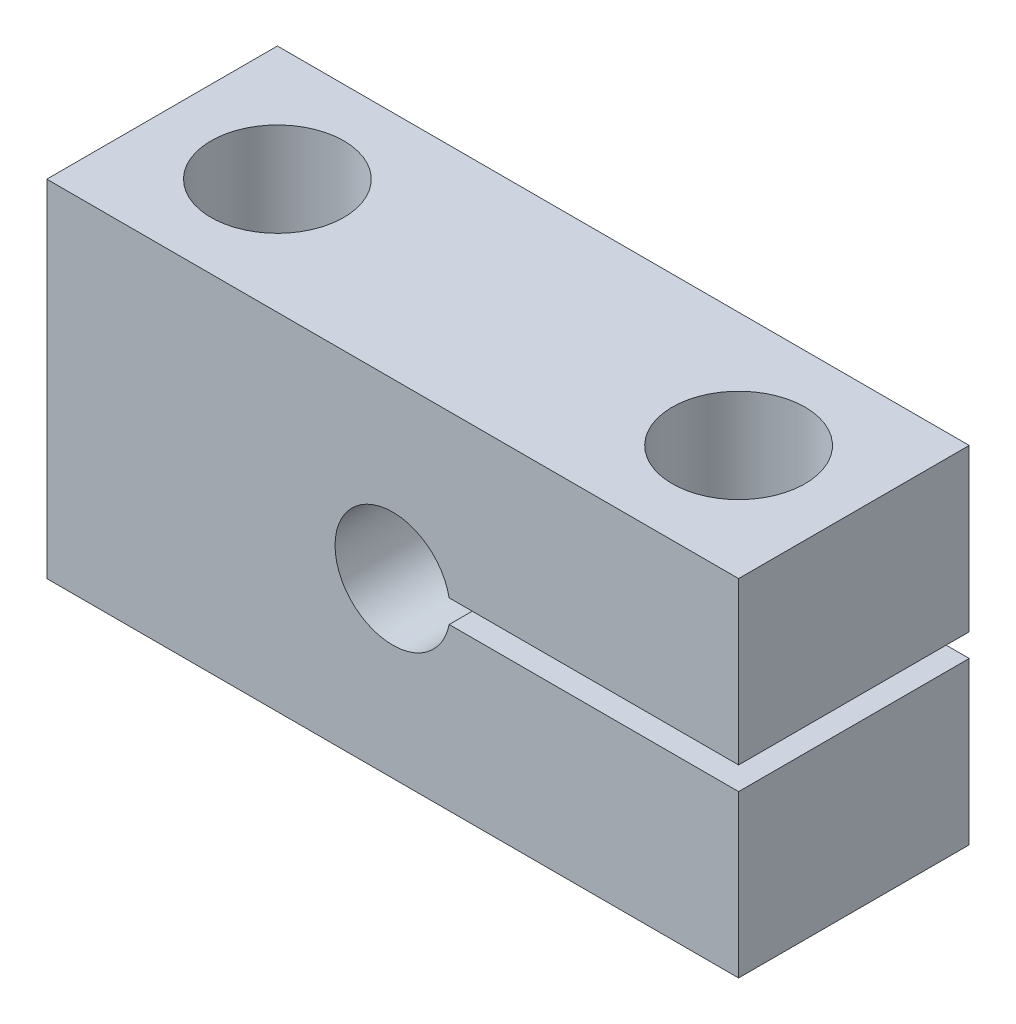
ISO-10303-21;
HEADER;
FILE_DESCRIPTION(('STEP AP214'),'2;1');
FILE_NAME('part.step','',(''),(''),'','','');
FILE_SCHEMA(('AUTOMOTIVE_DESIGN { 1 0 10303 214 1 1 1 1 }'));
ENDSEC;
DATA;
#1=APPLICATION_CONTEXT('core data for automotive mechanical design processes');
#2=APPLICATION_PROTOCOL_DEFINITION('international standard','automotive_design',2000,#1);
#3=PRODUCT_CONTEXT('',#1,'mechanical');
#4=PRODUCT('Part','Part','',(#3));
#5=PRODUCT_RELATED_PRODUCT_CATEGORY('part','',(#4));
#6=PRODUCT_DEFINITION_FORMATION('','',#4);
#7=PRODUCT_DEFINITION_CONTEXT('part definition',#1,'design');
#8=PRODUCT_DEFINITION('design','',#6,#7);
#9=PRODUCT_DEFINITION_SHAPE('','',#8);
#10=(LENGTH_UNIT() NAMED_UNIT(*) SI_UNIT(.MILLI.,.METRE.));
#11=(NAMED_UNIT(*) PLANE_ANGLE_UNIT() SI_UNIT($,.RADIAN.));
#12=(NAMED_UNIT(*) SI_UNIT($,.STERADIAN.) SOLID_ANGLE_UNIT());
#13=UNCERTAINTY_MEASURE_WITH_UNIT(LENGTH_MEASURE(1.E-05),#10,'distance_accuracy_value','');
#14=(GEOMETRIC_REPRESENTATION_CONTEXT(3) GLOBAL_UNCERTAINTY_ASSIGNED_CONTEXT((#13)) GLOBAL_UNIT_ASSIGNED_CONTEXT((#10,
#11,#12)) REPRESENTATION_CONTEXT('',''));
#15=CARTESIAN_POINT('',(0.,0.,0.));
#16=DIRECTION('',(0.,0.,1.));
#17=DIRECTION('',(1.,0.,0.));
#18=AXIS2_PLACEMENT_3D('',#15,#16,#17);
#19=CARTESIAN_POINT('',(-9.525,-4.7625,6.35));
#20=DIRECTION('',(1.,0.,0.));
#21=DIRECTION('',(0.,0.,-1.));
#22=AXIS2_PLACEMENT_3D('',#19,#20,#21);
#23=PLANE('',#22);
#24=DIRECTION('',(0.,-1.,0.));
#25=VECTOR('',#24,1.);
#26=CARTESIAN_POINT('',(-9.525,-4.7625,0.));
#27=LINE('',#26,#25);
#28=CARTESIAN_POINT('',(-9.525,4.7625,0.));
#29=VERTEX_POINT('',#28);
#30=CARTESIAN_POINT('',(-9.525,-4.7625,0.));
#31=VERTEX_POINT('',#30);
#32=EDGE_CURVE('E129',#29,#31,#27,.T.);
#33=ORIENTED_EDGE('',*,*,#32,.T.);
#34=DIRECTION('',(0.,0.,-1.));
#35=VECTOR('',#34,1.);
#36=CARTESIAN_POINT('',(-9.525,-4.7625,6.35));
#37=LINE('',#36,#35);
#38=CARTESIAN_POINT('',(-9.525,-4.7625,6.35));
#39=VERTEX_POINT('',#38);
#40=EDGE_CURVE('E11',#39,#31,#37,.T.);
#41=ORIENTED_EDGE('',*,*,#40,.F.);
#42=DIRECTION('',(0.,-1.,0.));
#43=VECTOR('',#42,1.);
#44=CARTESIAN_POINT('',(-9.525,-4.7625,6.35));
#45=LINE('',#44,#43);
#46=CARTESIAN_POINT('',(-9.525,4.7625,6.35));
#47=VERTEX_POINT('',#46);
#48=EDGE_CURVE('E144',#47,#39,#45,.T.);
#49=ORIENTED_EDGE('',*,*,#48,.F.);
#50=DIRECTION('',(0.,0.,-1.));
#51=VECTOR('',#50,1.);
#52=CARTESIAN_POINT('',(-9.525,4.7625,6.35));
#53=LINE('',#52,#51);
#54=EDGE_CURVE('E125',#47,#29,#53,.T.);
#55=ORIENTED_EDGE('',*,*,#54,.T.);
#56=EDGE_LOOP('',(#33,#41,#49,#55));
#57=FACE_BOUND('',#56,.T.);
#58=ADVANCED_FACE('F33',(#57),#23,.F.);
#59=CARTESIAN_POINT('',(-9.525,-4.7625,6.35));
#60=DIRECTION('',(0.,1.,0.));
#61=DIRECTION('',(0.,0.,1.));
#62=AXIS2_PLACEMENT_3D('',#59,#60,#61);
#63=PLANE('',#62);
#64=CARTESIAN_POINT('',(6.35,-4.7625,3.175));
#65=DIRECTION('',(0.,-1.,0.));
#66=DIRECTION('',(0.,0.,-1.));
#67=AXIS2_PLACEMENT_3D('',#64,#65,#66);
#68=CIRCLE('',#67,1.8288);
#69=CARTESIAN_POINT('',(6.35,-4.7625,1.3462));
#70=VERTEX_POINT('',#69);
#71=EDGE_CURVE('E189',#70,#70,#68,.T.);
#72=ORIENTED_EDGE('',*,*,#71,.F.);
#73=EDGE_LOOP('',(#72));
#74=FACE_BOUND('',#73,.T.);
#75=CARTESIAN_POINT('',(-6.35,-4.7625,3.175));
#76=DIRECTION('',(0.,-1.,0.));
#77=DIRECTION('',(0.,0.,-1.));
#78=AXIS2_PLACEMENT_3D('',#75,#76,#77);
#79=CIRCLE('',#78,1.8288);
#80=CARTESIAN_POINT('',(-6.35,-4.7625,1.3462));
#81=VERTEX_POINT('',#80);
#82=EDGE_CURVE('E177',#81,#81,#79,.T.);
#83=ORIENTED_EDGE('',*,*,#82,.F.);
#84=EDGE_LOOP('',(#83));
#85=FACE_BOUND('',#84,.T.);
#86=DIRECTION('',(1.,0.,0.));
#87=VECTOR('',#86,1.);
#88=CARTESIAN_POINT('',(-9.525,-4.7625,0.));
#89=LINE('',#88,#87);
#90=CARTESIAN_POINT('',(9.525,-4.7625,0.));
#91=VERTEX_POINT('',#90);
#92=EDGE_CURVE('E132',#31,#91,#89,.T.);
#93=ORIENTED_EDGE('',*,*,#92,.T.);
#94=DIRECTION('',(0.,0.,-1.));
#95=VECTOR('',#94,1.);
#96=CARTESIAN_POINT('',(9.525,-4.7625,6.35));
#97=LINE('',#96,#95);
#98=CARTESIAN_POINT('',(9.525,-4.7625,6.35));
#99=VERTEX_POINT('',#98);
#100=EDGE_CURVE('E41',#99,#91,#97,.T.);
#101=ORIENTED_EDGE('',*,*,#100,.F.);
#102=DIRECTION('',(1.,0.,0.));
#103=VECTOR('',#102,1.);
#104=CARTESIAN_POINT('',(-9.525,-4.7625,6.35));
#105=LINE('',#104,#103);
#106=EDGE_CURVE('E92',#39,#99,#105,.T.);
#107=ORIENTED_EDGE('',*,*,#106,.F.);
#108=ORIENTED_EDGE('',*,*,#40,.T.);
#109=EDGE_LOOP('',(#93,#101,#107,#108));
#110=FACE_BOUND('',#109,.T.);
#111=ADVANCED_FACE('F215',(#74,#85,#110),#63,.F.);
#112=CARTESIAN_POINT('',(9.525,-4.7625,6.35));
#113=DIRECTION('',(-1.,0.,0.));
#114=DIRECTION('',(0.,0.,1.));
#115=AXIS2_PLACEMENT_3D('',#112,#113,#114);
#116=PLANE('',#115);
#117=DIRECTION('',(0.,1.,0.));
#118=VECTOR('',#117,1.);
#119=CARTESIAN_POINT('',(9.525,-4.7625,0.));
#120=LINE('',#119,#118);
#121=CARTESIAN_POINT('',(9.525,-0.3175,0.));
#122=VERTEX_POINT('',#121);
#123=EDGE_CURVE('E135',#91,#122,#120,.T.);
#124=ORIENTED_EDGE('',*,*,#123,.T.);
#125=DIRECTION('',(0.,0.,-1.));
#126=VECTOR('',#125,1.);
#127=CARTESIAN_POINT('',(9.525,-0.3175,6.35));
#128=LINE('',#127,#126);
#129=CARTESIAN_POINT('',(9.525,-0.3175,6.35));
#130=VERTEX_POINT('',#129);
#131=EDGE_CURVE('E151',#130,#122,#128,.T.);
#132=ORIENTED_EDGE('',*,*,#131,.F.);
#133=DIRECTION('',(0.,1.,0.));
#134=VECTOR('',#133,1.);
#135=CARTESIAN_POINT('',(9.525,-4.7625,6.35));
#136=LINE('',#135,#134);
#137=EDGE_CURVE('E159',#99,#130,#136,.T.);
#138=ORIENTED_EDGE('',*,*,#137,.F.);
#139=ORIENTED_EDGE('',*,*,#100,.T.);
#140=EDGE_LOOP('',(#124,#132,#138,#139));
#141=FACE_BOUND('',#140,.T.);
#142=ADVANCED_FACE('F157',(#141),#116,.F.);
#143=CARTESIAN_POINT('',(1.55542598666732,-0.3175,6.35));
#144=DIRECTION('',(0.,-1.,0.));
#145=DIRECTION('',(0.,0.,-1.));
#146=AXIS2_PLACEMENT_3D('',#143,#144,#145);
#147=PLANE('',#146);
#148=CARTESIAN_POINT('',(6.35,-0.3175,3.175));
#149=DIRECTION('',(0.,-1.,0.));
#150=DIRECTION('',(0.,0.,-1.));
#151=AXIS2_PLACEMENT_3D('',#148,#149,#150);
#152=CIRCLE('',#151,1.8288);
#153=CARTESIAN_POINT('',(6.35,-0.3175,1.3462));
#154=VERTEX_POINT('',#153);
#155=EDGE_CURVE('E180',#154,#154,#152,.T.);
#156=ORIENTED_EDGE('',*,*,#155,.T.);
#157=EDGE_LOOP('',(#156));
#158=FACE_BOUND('',#157,.T.);
#159=DIRECTION('',(-1.,0.,0.));
#160=VECTOR('',#159,1.);
#161=CARTESIAN_POINT('',(1.55542598666732,-0.3175,0.));
#162=LINE('',#161,#160);
#163=CARTESIAN_POINT('',(1.55542598666732,-0.3175,0.));
#164=VERTEX_POINT('',#163);
#165=EDGE_CURVE('E137',#122,#164,#162,.T.);
#166=ORIENTED_EDGE('',*,*,#165,.T.);
#167=DIRECTION('',(0.,0.,-1.));
#168=VECTOR('',#167,1.);
#169=CARTESIAN_POINT('',(1.55542598666732,-0.3175,6.35));
#170=LINE('',#169,#168);
#171=CARTESIAN_POINT('',(1.55542598666732,-0.3175,6.35));
#172=VERTEX_POINT('',#171);
#173=EDGE_CURVE('E148',#172,#164,#170,.T.);
#174=ORIENTED_EDGE('',*,*,#173,.F.);
#175=DIRECTION('',(-1.,0.,0.));
#176=VECTOR('',#175,1.);
#177=CARTESIAN_POINT('',(1.55542598666732,-0.3175,6.35));
#178=LINE('',#177,#176);
#179=EDGE_CURVE('E171',#130,#172,#178,.T.);
#180=ORIENTED_EDGE('',*,*,#179,.F.);
#181=ORIENTED_EDGE('',*,*,#131,.T.);
#182=EDGE_LOOP('',(#166,#174,#180,#181));
#183=FACE_BOUND('',#182,.T.);
#184=ADVANCED_FACE('F167',(#158,#183),#147,.F.);
#185=CARTESIAN_POINT('',(0.,0.,6.35));
#186=DIRECTION('',(0.,0.,-1.));
#187=DIRECTION('',(-1.,0.,0.));
#188=AXIS2_PLACEMENT_3D('',#185,#186,#187);
#189=CYLINDRICAL_SURFACE('',#188,1.5875);
#190=CARTESIAN_POINT('',(0.,0.,0.));
#191=DIRECTION('',(0.,0.,-1.));
#192=DIRECTION('',(1.,0.,0.));
#193=AXIS2_PLACEMENT_3D('',#190,#191,#192);
#194=CIRCLE('',#193,1.5875);
#195=CARTESIAN_POINT('',(1.55542598666732,0.3175,0.));
#196=VERTEX_POINT('',#195);
#197=EDGE_CURVE('E139',#164,#196,#194,.T.);
#198=ORIENTED_EDGE('',*,*,#197,.T.);
#199=DIRECTION('',(0.,0.,-1.));
#200=VECTOR('',#199,1.);
#201=CARTESIAN_POINT('',(1.55542598666732,0.3175,6.35));
#202=LINE('',#201,#200);
#203=CARTESIAN_POINT('',(1.55542598666732,0.3175,6.35));
#204=VERTEX_POINT('',#203);
#205=EDGE_CURVE('E120',#204,#196,#202,.T.);
#206=ORIENTED_EDGE('',*,*,#205,.F.);
#207=CARTESIAN_POINT('',(0.,0.,6.35));
#208=DIRECTION('',(0.,0.,-1.));
#209=DIRECTION('',(1.,0.,0.));
#210=AXIS2_PLACEMENT_3D('',#207,#208,#209);
#211=CIRCLE('',#210,1.5875);
#212=EDGE_CURVE('E111',#172,#204,#211,.T.);
#213=ORIENTED_EDGE('',*,*,#212,.F.);
#214=ORIENTED_EDGE('',*,*,#173,.T.);
#215=EDGE_LOOP('',(#198,#206,#213,#214));
#216=FACE_BOUND('',#215,.T.);
#217=ADVANCED_FACE('F170',(#216),#189,.F.);
#218=CARTESIAN_POINT('',(1.55542598666732,0.3175,6.35));
#219=DIRECTION('',(0.,1.,0.));
#220=DIRECTION('',(0.,0.,1.));
#221=AXIS2_PLACEMENT_3D('',#218,#219,#220);
#222=PLANE('',#221);
#223=CARTESIAN_POINT('',(6.35,0.3175,3.175));
#224=DIRECTION('',(0.,1.,0.));
#225=DIRECTION('',(0.,0.,1.));
#226=AXIS2_PLACEMENT_3D('',#223,#224,#225);
#227=CIRCLE('',#226,1.8288);
#228=CARTESIAN_POINT('',(6.35,0.3175,1.3462));
#229=VERTEX_POINT('',#228);
#230=EDGE_CURVE('E185',#229,#229,#227,.T.);
#231=ORIENTED_EDGE('',*,*,#230,.T.);
#232=EDGE_LOOP('',(#231));
#233=FACE_BOUND('',#232,.T.);
#234=DIRECTION('',(1.,0.,0.));
#235=VECTOR('',#234,1.);
#236=CARTESIAN_POINT('',(1.55542598666732,0.3175,0.));
#237=LINE('',#236,#235);
#238=CARTESIAN_POINT('',(9.525,0.3175,0.));
#239=VERTEX_POINT('',#238);
#240=EDGE_CURVE('E119',#196,#239,#237,.T.);
#241=ORIENTED_EDGE('',*,*,#240,.T.);
#242=DIRECTION('',(0.,0.,-1.));
#243=VECTOR('',#242,1.);
#244=CARTESIAN_POINT('',(9.525,0.3175,6.35));
#245=LINE('',#244,#243);
#246=CARTESIAN_POINT('',(9.525,0.3175,6.35));
#247=VERTEX_POINT('',#246);
#248=EDGE_CURVE('E116',#247,#239,#245,.T.);
#249=ORIENTED_EDGE('',*,*,#248,.F.);
#250=DIRECTION('',(1.,0.,0.));
#251=VECTOR('',#250,1.);
#252=CARTESIAN_POINT('',(1.55542598666732,0.3175,6.35));
#253=LINE('',#252,#251);
#254=EDGE_CURVE('E105',#204,#247,#253,.T.);
#255=ORIENTED_EDGE('',*,*,#254,.F.);
#256=ORIENTED_EDGE('',*,*,#205,.T.);
#257=EDGE_LOOP('',(#241,#249,#255,#256));
#258=FACE_BOUND('',#257,.T.);
#259=ADVANCED_FACE('F117',(#233,#258),#222,.F.);
#260=CARTESIAN_POINT('',(9.525,0.3175,6.35));
#261=DIRECTION('',(-1.,0.,0.));
#262=DIRECTION('',(0.,0.,1.));
#263=AXIS2_PLACEMENT_3D('',#260,#261,#262);
#264=PLANE('',#263);
#265=DIRECTION('',(0.,1.,0.));
#266=VECTOR('',#265,1.);
#267=CARTESIAN_POINT('',(9.525,0.3175,0.));
#268=LINE('',#267,#266);
#269=CARTESIAN_POINT('',(9.525,4.7625,0.));
#270=VERTEX_POINT('',#269);
#271=EDGE_CURVE('E78',#239,#270,#268,.T.);
#272=ORIENTED_EDGE('',*,*,#271,.T.);
#273=DIRECTION('',(0.,0.,-1.));
#274=VECTOR('',#273,1.);
#275=CARTESIAN_POINT('',(9.525,4.7625,6.35));
#276=LINE('',#275,#274);
#277=CARTESIAN_POINT('',(9.525,4.7625,6.35));
#278=VERTEX_POINT('',#277);
#279=EDGE_CURVE('E121',#278,#270,#276,.T.);
#280=ORIENTED_EDGE('',*,*,#279,.F.);
#281=DIRECTION('',(0.,1.,0.));
#282=VECTOR('',#281,1.);
#283=CARTESIAN_POINT('',(9.525,0.3175,6.35));
#284=LINE('',#283,#282);
#285=EDGE_CURVE('E109',#247,#278,#284,.T.);
#286=ORIENTED_EDGE('',*,*,#285,.F.);
#287=ORIENTED_EDGE('',*,*,#248,.T.);
#288=EDGE_LOOP('',(#272,#280,#286,#287));
#289=FACE_BOUND('',#288,.T.);
#290=ADVANCED_FACE('F123',(#289),#264,.F.);
#291=CARTESIAN_POINT('',(-9.525,4.7625,6.35));
#292=DIRECTION('',(0.,-1.,0.));
#293=DIRECTION('',(0.,0.,-1.));
#294=AXIS2_PLACEMENT_3D('',#291,#292,#293);
#295=PLANE('',#294);
#296=CARTESIAN_POINT('',(6.35,4.7625,3.175));
#297=DIRECTION('',(0.,-1.,0.));
#298=DIRECTION('',(0.,0.,-1.));
#299=AXIS2_PLACEMENT_3D('',#296,#297,#298);
#300=CIRCLE('',#299,1.8288);
#301=CARTESIAN_POINT('',(6.35,4.7625,1.3462));
#302=VERTEX_POINT('',#301);
#303=EDGE_CURVE('E188',#302,#302,#300,.T.);
#304=ORIENTED_EDGE('',*,*,#303,.T.);
#305=EDGE_LOOP('',(#304));
#306=FACE_BOUND('',#305,.T.);
#307=CARTESIAN_POINT('',(-6.35,4.7625,3.175));
#308=DIRECTION('',(0.,-1.,0.));
#309=DIRECTION('',(0.,0.,-1.));
#310=AXIS2_PLACEMENT_3D('',#307,#308,#309);
#311=CIRCLE('',#310,1.8288);
#312=CARTESIAN_POINT('',(-6.35,4.7625,1.3462));
#313=VERTEX_POINT('',#312);
#314=EDGE_CURVE('E133',#313,#313,#311,.T.);
#315=ORIENTED_EDGE('',*,*,#314,.T.);
#316=EDGE_LOOP('',(#315));
#317=FACE_BOUND('',#316,.T.);
#318=DIRECTION('',(-1.,0.,0.));
#319=VECTOR('',#318,1.);
#320=CARTESIAN_POINT('',(-9.525,4.7625,0.));
#321=LINE('',#320,#319);
#322=EDGE_CURVE('E84',#270,#29,#321,.T.);
#323=ORIENTED_EDGE('',*,*,#322,.T.);
#324=ORIENTED_EDGE('',*,*,#54,.F.);
#325=DIRECTION('',(-1.,0.,0.));
#326=VECTOR('',#325,1.);
#327=CARTESIAN_POINT('',(-9.525,4.7625,6.35));
#328=LINE('',#327,#326);
#329=EDGE_CURVE('E49',#278,#47,#328,.T.);
#330=ORIENTED_EDGE('',*,*,#329,.F.);
#331=ORIENTED_EDGE('',*,*,#279,.T.);
#332=EDGE_LOOP('',(#323,#324,#330,#331));
#333=FACE_BOUND('',#332,.T.);
#334=ADVANCED_FACE('F195',(#306,#317,#333),#295,.F.);
#335=CARTESIAN_POINT('',(0.,0.,6.35));
#336=DIRECTION('',(0.,0.,1.));
#337=DIRECTION('',(1.,0.,0.));
#338=AXIS2_PLACEMENT_3D('',#335,#336,#337);
#339=PLANE('',#338);
#340=ORIENTED_EDGE('',*,*,#48,.T.);
#341=ORIENTED_EDGE('',*,*,#106,.T.);
#342=ORIENTED_EDGE('',*,*,#137,.T.);
#343=ORIENTED_EDGE('',*,*,#179,.T.);
#344=ORIENTED_EDGE('',*,*,#212,.T.);
#345=ORIENTED_EDGE('',*,*,#254,.T.);
#346=ORIENTED_EDGE('',*,*,#285,.T.);
#347=ORIENTED_EDGE('',*,*,#329,.T.);
#348=EDGE_LOOP('',(#340,#341,#342,#343,#344,#345,#346,#347));
#349=FACE_BOUND('',#348,.T.);
#350=ADVANCED_FACE('F107',(#349),#339,.T.);
#351=CARTESIAN_POINT('',(0.,0.,0.));
#352=DIRECTION('',(0.,0.,1.));
#353=DIRECTION('',(1.,0.,0.));
#354=AXIS2_PLACEMENT_3D('',#351,#352,#353);
#355=PLANE('',#354);
#356=ORIENTED_EDGE('',*,*,#32,.F.);
#357=ORIENTED_EDGE('',*,*,#322,.F.);
#358=ORIENTED_EDGE('',*,*,#271,.F.);
#359=ORIENTED_EDGE('',*,*,#240,.F.);
#360=ORIENTED_EDGE('',*,*,#197,.F.);
#361=ORIENTED_EDGE('',*,*,#165,.F.);
#362=ORIENTED_EDGE('',*,*,#123,.F.);
#363=ORIENTED_EDGE('',*,*,#92,.F.);
#364=EDGE_LOOP('',(#356,#357,#358,#359,#360,#361,#362,#363));
#365=FACE_BOUND('',#364,.T.);
#366=ADVANCED_FACE('F163',(#365),#355,.F.);
#367=CARTESIAN_POINT('',(-6.35,4.7625,3.175));
#368=DIRECTION('',(0.,-1.,0.));
#369=DIRECTION('',(0.,0.,-1.));
#370=AXIS2_PLACEMENT_3D('',#367,#368,#369);
#371=CYLINDRICAL_SURFACE('',#370,1.8288);
#372=CARTESIAN_POINT('',(-6.35,4.7625,1.3462));
#373=CARTESIAN_POINT('',(-6.35,4.66328125,1.3462));
#374=CARTESIAN_POINT('',(-6.35,4.5640625,1.3462));
#375=CARTESIAN_POINT('',(-6.35,4.365625,1.3462));
#376=CARTESIAN_POINT('',(-6.35,4.26640625,1.3462));
#377=CARTESIAN_POINT('',(-6.35,4.06796875,1.3462));
#378=CARTESIAN_POINT('',(-6.35,3.96875,1.3462));
#379=CARTESIAN_POINT('',(-6.35,3.7703125,1.3462));
#380=CARTESIAN_POINT('',(-6.35,3.67109375,1.3462));
#381=CARTESIAN_POINT('',(-6.35,3.47265625,1.3462));
#382=CARTESIAN_POINT('',(-6.35,3.3734375,1.3462));
#383=CARTESIAN_POINT('',(-6.35,3.175,1.3462));
#384=CARTESIAN_POINT('',(-6.35,3.07578125,1.3462));
#385=CARTESIAN_POINT('',(-6.35,2.87734375,1.3462));
#386=CARTESIAN_POINT('',(-6.35,2.778125,1.3462));
#387=CARTESIAN_POINT('',(-6.35,2.5796875,1.3462));
#388=CARTESIAN_POINT('',(-6.35,2.48046875,1.3462));
#389=CARTESIAN_POINT('',(-6.35,2.28203125,1.3462));
#390=CARTESIAN_POINT('',(-6.35,2.1828125,1.3462));
#391=CARTESIAN_POINT('',(-6.35,1.984375,1.3462));
#392=CARTESIAN_POINT('',(-6.35,1.88515625,1.3462));
#393=CARTESIAN_POINT('',(-6.35,1.68671875,1.3462));
#394=CARTESIAN_POINT('',(-6.35,1.5875,1.3462));
#395=CARTESIAN_POINT('',(-6.35,1.3890625,1.3462));
#396=CARTESIAN_POINT('',(-6.35,1.28984375,1.3462));
#397=CARTESIAN_POINT('',(-6.35,1.09140625,1.3462));
#398=CARTESIAN_POINT('',(-6.35,0.9921875,1.3462));
#399=CARTESIAN_POINT('',(-6.35,0.793750000000001,1.3462));
#400=CARTESIAN_POINT('',(-6.35,0.694531250000001,1.3462));
#401=CARTESIAN_POINT('',(-6.35,0.496093750000001,1.3462));
#402=CARTESIAN_POINT('',(-6.35,0.396875000000001,1.3462));
#403=CARTESIAN_POINT('',(-6.35,0.198437500000001,1.3462));
#404=CARTESIAN_POINT('',(-6.35,0.0992187500000009,1.3462));
#405=CARTESIAN_POINT('',(-6.35,-0.0992187499999992,1.3462));
#406=CARTESIAN_POINT('',(-6.35,-0.198437499999999,1.3462));
#407=CARTESIAN_POINT('',(-6.35,-0.396874999999999,1.3462));
#408=CARTESIAN_POINT('',(-6.35,-0.496093749999999,1.3462));
#409=CARTESIAN_POINT('',(-6.35,-0.694531249999999,1.3462));
#410=CARTESIAN_POINT('',(-6.35,-0.79375,1.3462));
#411=CARTESIAN_POINT('',(-6.35,-0.9921875,1.3462));
#412=CARTESIAN_POINT('',(-6.35,-1.09140625,1.3462));
#413=CARTESIAN_POINT('',(-6.35,-1.28984375,1.3462));
#414=CARTESIAN_POINT('',(-6.35,-1.3890625,1.3462));
#415=CARTESIAN_POINT('',(-6.35,-1.5875,1.3462));
#416=CARTESIAN_POINT('',(-6.35,-1.68671875,1.3462));
#417=CARTESIAN_POINT('',(-6.35,-1.88515625,1.3462));
#418=CARTESIAN_POINT('',(-6.35,-1.984375,1.3462));
#419=CARTESIAN_POINT('',(-6.35,-2.1828125,1.3462));
#420=CARTESIAN_POINT('',(-6.35,-2.28203125,1.3462));
#421=CARTESIAN_POINT('',(-6.35,-2.48046875,1.3462));
#422=CARTESIAN_POINT('',(-6.35,-2.5796875,1.3462));
#423=CARTESIAN_POINT('',(-6.35,-2.778125,1.3462));
#424=CARTESIAN_POINT('',(-6.35,-2.87734375,1.3462));
#425=CARTESIAN_POINT('',(-6.35,-3.07578125,1.3462));
#426=CARTESIAN_POINT('',(-6.35,-3.175,1.3462));
#427=CARTESIAN_POINT('',(-6.35,-3.3734375,1.3462));
#428=CARTESIAN_POINT('',(-6.35,-3.47265625,1.3462));
#429=CARTESIAN_POINT('',(-6.35,-3.67109375,1.3462));
#430=CARTESIAN_POINT('',(-6.35,-3.7703125,1.3462));
#431=CARTESIAN_POINT('',(-6.35,-3.96875,1.3462));
#432=CARTESIAN_POINT('',(-6.35,-4.06796875,1.3462));
#433=CARTESIAN_POINT('',(-6.35,-4.26640625,1.3462));
#434=CARTESIAN_POINT('',(-6.35,-4.365625,1.3462));
#435=CARTESIAN_POINT('',(-6.35,-4.5640625,1.3462));
#436=CARTESIAN_POINT('',(-6.35,-4.66328125,1.3462));
#437=CARTESIAN_POINT('',(-6.35,-4.7625,1.3462));
#438=B_SPLINE_CURVE_WITH_KNOTS('',3,(#372,#373,#374,#375,#376,#377,#378,#379,#380,#381,#382,
#383,#384,#385,#386,#387,#388,#389,#390,#391,#392,#393,#394,#395,#396,#397,#398,#399,#400,#401,
#402,#403,#404,#405,#406,#407,#408,#409,#410,#411,#412,#413,#414,#415,#416,#417,#418,#419,#420,
#421,#422,#423,#424,#425,#426,#427,#428,#429,#430,#431,#432,#433,#434,#435,#436,#437),
.UNSPECIFIED.,.F.,.F.,(4,2,2,2,2,2,2,2,2,2,2,2,2,2,2,2,2,2,2,2,2,2,2,2,2,2,2,2,2,2,2,2,4),(0.,
0.29765625,0.5953125,0.892968750000001,1.190625,1.48828125,1.7859375,2.08359375,2.38125,
2.67890625,2.9765625,3.27421875,3.571875,3.86953125,4.1671875,4.46484375,4.7625,5.06015625,
5.3578125,5.65546875,5.953125,6.25078125,6.5484375,6.84609375,7.14375,7.44140625,7.7390625,
8.03671875,8.334375,8.63203125,8.9296875,9.22734375,9.525),.UNSPECIFIED.);
#439=EDGE_CURVE('BSEAM202',#313,#81,#438,.T.);
#440=ORIENTED_EDGE('',*,*,#314,.F.);
#441=ORIENTED_EDGE('',*,*,#82,.T.);
#442=ORIENTED_EDGE('',*,*,#439,.T.);
#443=ORIENTED_EDGE('',*,*,#439,.F.);
#444=EDGE_LOOP('',(#440,#442,#441,#443));
#445=FACE_BOUND('',#444,.T.);
#446=ADVANCED_FACE('F202',(#445),#371,.F.);
#447=CARTESIAN_POINT('',(6.35,4.7625,3.175));
#448=DIRECTION('',(0.,-1.,0.));
#449=DIRECTION('',(0.,0.,-1.));
#450=AXIS2_PLACEMENT_3D('',#447,#448,#449);
#451=CYLINDRICAL_SURFACE('',#450,1.8288);
#452=CARTESIAN_POINT('',(6.35,4.7625,1.3462));
#453=CARTESIAN_POINT('',(6.35,4.71619791666667,1.3462));
#454=CARTESIAN_POINT('',(6.35,4.66989583333333,1.3462));
#455=CARTESIAN_POINT('',(6.35,4.57729166666667,1.3462));
#456=CARTESIAN_POINT('',(6.35,4.53098958333333,1.3462));
#457=CARTESIAN_POINT('',(6.35,4.43838541666667,1.3462));
#458=CARTESIAN_POINT('',(6.35,4.39208333333333,1.3462));
#459=CARTESIAN_POINT('',(6.35,4.29947916666667,1.3462));
#460=CARTESIAN_POINT('',(6.35,4.25317708333333,1.3462));
#461=CARTESIAN_POINT('',(6.35,4.16057291666667,1.3462));
#462=CARTESIAN_POINT('',(6.35,4.11427083333333,1.3462));
#463=CARTESIAN_POINT('',(6.35,4.02166666666667,1.3462));
#464=CARTESIAN_POINT('',(6.35,3.97536458333333,1.3462));
#465=CARTESIAN_POINT('',(6.35,3.88276041666667,1.3462));
#466=CARTESIAN_POINT('',(6.35,3.83645833333333,1.3462));
#467=CARTESIAN_POINT('',(6.35,3.74385416666667,1.3462));
#468=CARTESIAN_POINT('',(6.35,3.69755208333333,1.3462));
#469=CARTESIAN_POINT('',(6.35,3.60494791666667,1.3462));
#470=CARTESIAN_POINT('',(6.35,3.55864583333333,1.3462));
#471=CARTESIAN_POINT('',(6.35,3.46604166666667,1.3462));
#472=CARTESIAN_POINT('',(6.35,3.41973958333333,1.3462));
#473=CARTESIAN_POINT('',(6.35,3.32713541666667,1.3462));
#474=CARTESIAN_POINT('',(6.35,3.28083333333333,1.3462));
#475=CARTESIAN_POINT('',(6.35,3.18822916666667,1.3462));
#476=CARTESIAN_POINT('',(6.35,3.14192708333333,1.3462));
#477=CARTESIAN_POINT('',(6.35,3.04932291666667,1.3462));
#478=CARTESIAN_POINT('',(6.35,3.00302083333333,1.3462));
#479=CARTESIAN_POINT('',(6.35,2.91041666666667,1.3462));
#480=CARTESIAN_POINT('',(6.35,2.86411458333333,1.3462));
#481=CARTESIAN_POINT('',(6.35,2.77151041666667,1.3462));
#482=CARTESIAN_POINT('',(6.35,2.72520833333333,1.3462));
#483=CARTESIAN_POINT('',(6.35,2.63260416666667,1.3462));
#484=CARTESIAN_POINT('',(6.35,2.58630208333333,1.3462));
#485=CARTESIAN_POINT('',(6.35,2.49369791666667,1.3462));
#486=CARTESIAN_POINT('',(6.35,2.44739583333333,1.3462));
#487=CARTESIAN_POINT('',(6.35,2.35479166666667,1.3462));
#488=CARTESIAN_POINT('',(6.35,2.30848958333333,1.3462));
#489=CARTESIAN_POINT('',(6.35,2.21588541666667,1.3462));
#490=CARTESIAN_POINT('',(6.35,2.16958333333333,1.3462));
#491=CARTESIAN_POINT('',(6.35,2.07697916666667,1.3462));
#492=CARTESIAN_POINT('',(6.35,2.03067708333333,1.3462));
#493=CARTESIAN_POINT('',(6.35,1.93807291666667,1.3462));
#494=CARTESIAN_POINT('',(6.35,1.89177083333333,1.3462));
#495=CARTESIAN_POINT('',(6.35,1.79916666666667,1.3462));
#496=CARTESIAN_POINT('',(6.35,1.75286458333333,1.3462));
#497=CARTESIAN_POINT('',(6.35,1.66026041666667,1.3462));
#498=CARTESIAN_POINT('',(6.35,1.61395833333333,1.3462));
#499=CARTESIAN_POINT('',(6.35,1.52135416666667,1.3462));
#500=CARTESIAN_POINT('',(6.35,1.47505208333333,1.3462));
#501=CARTESIAN_POINT('',(6.35,1.38244791666667,1.3462));
#502=CARTESIAN_POINT('',(6.35,1.33614583333333,1.3462));
#503=CARTESIAN_POINT('',(6.35,1.24354166666667,1.3462));
#504=CARTESIAN_POINT('',(6.35,1.19723958333333,1.3462));
#505=CARTESIAN_POINT('',(6.35,1.10463541666667,1.3462));
#506=CARTESIAN_POINT('',(6.35,1.05833333333333,1.3462));
#507=CARTESIAN_POINT('',(6.35,0.965729166666667,1.3462));
#508=CARTESIAN_POINT('',(6.35,0.919427083333334,1.3462));
#509=CARTESIAN_POINT('',(6.35,0.826822916666667,1.3462));
#510=CARTESIAN_POINT('',(6.35,0.780520833333334,1.3462));
#511=CARTESIAN_POINT('',(6.35,0.687916666666667,1.3462));
#512=CARTESIAN_POINT('',(6.35,0.641614583333334,1.3462));
#513=CARTESIAN_POINT('',(6.35,0.549010416666667,1.3462));
#514=CARTESIAN_POINT('',(6.35,0.502708333333334,1.3462));
#515=CARTESIAN_POINT('',(6.35,0.410104166666667,1.3462));
#516=CARTESIAN_POINT('',(6.35,0.363802083333334,1.3462));
#517=CARTESIAN_POINT('',(6.35,0.3175,1.3462));
#518=B_SPLINE_CURVE_WITH_KNOTS('',3,(#452,#453,#454,#455,#456,#457,#458,#459,#460,#461,#462,
#463,#464,#465,#466,#467,#468,#469,#470,#471,#472,#473,#474,#475,#476,#477,#478,#479,#480,#481,
#482,#483,#484,#485,#486,#487,#488,#489,#490,#491,#492,#493,#494,#495,#496,#497,#498,#499,#500,
#501,#502,#503,#504,#505,#506,#507,#508,#509,#510,#511,#512,#513,#514,#515,#516,#517),
.UNSPECIFIED.,.F.,.F.,(4,2,2,2,2,2,2,2,2,2,2,2,2,2,2,2,2,2,2,2,2,2,2,2,2,2,2,2,2,2,2,2,4),(0.,
0.138906249999999,0.277812499999999,0.41671875,0.555625,0.69453125,0.8334375,0.97234375,1.11125,
1.25015625,1.3890625,1.52796875,1.666875,1.80578125,1.9446875,2.08359375,2.2225,2.36140625,
2.5003125,2.63921875,2.778125,2.91703125,3.0559375,3.19484375,3.33375,3.47265625,3.6115625,
3.75046875,3.889375,4.02828125,4.1671875,4.30609375,4.445),.UNSPECIFIED.);
#519=EDGE_CURVE('BSEAM198',#302,#229,#518,.T.);
#520=ORIENTED_EDGE('',*,*,#303,.F.);
#521=ORIENTED_EDGE('',*,*,#230,.F.);
#522=ORIENTED_EDGE('',*,*,#519,.T.);
#523=ORIENTED_EDGE('',*,*,#519,.F.);
#524=EDGE_LOOP('',(#520,#522,#521,#523));
#525=FACE_BOUND('',#524,.T.);
#526=ADVANCED_FACE('F198',(#525),#451,.F.);
#527=CARTESIAN_POINT('',(6.35,-4.7625,1.3462));
#528=CARTESIAN_POINT('',(6.35,-4.71619791666667,1.3462));
#529=CARTESIAN_POINT('',(6.35,-4.66989583333333,1.3462));
#530=CARTESIAN_POINT('',(6.35,-4.57729166666667,1.3462));
#531=CARTESIAN_POINT('',(6.35,-4.53098958333333,1.3462));
#532=CARTESIAN_POINT('',(6.35,-4.43838541666667,1.3462));
#533=CARTESIAN_POINT('',(6.35,-4.39208333333333,1.3462));
#534=CARTESIAN_POINT('',(6.35,-4.29947916666667,1.3462));
#535=CARTESIAN_POINT('',(6.35,-4.25317708333333,1.3462));
#536=CARTESIAN_POINT('',(6.35,-4.16057291666667,1.3462));
#537=CARTESIAN_POINT('',(6.35,-4.11427083333333,1.3462));
#538=CARTESIAN_POINT('',(6.35,-4.02166666666667,1.3462));
#539=CARTESIAN_POINT('',(6.35,-3.97536458333333,1.3462));
#540=CARTESIAN_POINT('',(6.35,-3.88276041666667,1.3462));
#541=CARTESIAN_POINT('',(6.35,-3.83645833333333,1.3462));
#542=CARTESIAN_POINT('',(6.35,-3.74385416666667,1.3462));
#543=CARTESIAN_POINT('',(6.35,-3.69755208333333,1.3462));
#544=CARTESIAN_POINT('',(6.35,-3.60494791666667,1.3462));
#545=CARTESIAN_POINT('',(6.35,-3.55864583333333,1.3462));
#546=CARTESIAN_POINT('',(6.35,-3.46604166666667,1.3462));
#547=CARTESIAN_POINT('',(6.35,-3.41973958333333,1.3462));
#548=CARTESIAN_POINT('',(6.35,-3.32713541666667,1.3462));
#549=CARTESIAN_POINT('',(6.35,-3.28083333333333,1.3462));
#550=CARTESIAN_POINT('',(6.35,-3.18822916666667,1.3462));
#551=CARTESIAN_POINT('',(6.35,-3.14192708333333,1.3462));
#552=CARTESIAN_POINT('',(6.35,-3.04932291666667,1.3462));
#553=CARTESIAN_POINT('',(6.35,-3.00302083333333,1.3462));
#554=CARTESIAN_POINT('',(6.35,-2.91041666666667,1.3462));
#555=CARTESIAN_POINT('',(6.35,-2.86411458333333,1.3462));
#556=CARTESIAN_POINT('',(6.35,-2.77151041666667,1.3462));
#557=CARTESIAN_POINT('',(6.35,-2.72520833333333,1.3462));
#558=CARTESIAN_POINT('',(6.35,-2.63260416666667,1.3462));
#559=CARTESIAN_POINT('',(6.35,-2.58630208333333,1.3462));
#560=CARTESIAN_POINT('',(6.35,-2.49369791666667,1.3462));
#561=CARTESIAN_POINT('',(6.35,-2.44739583333333,1.3462));
#562=CARTESIAN_POINT('',(6.35,-2.35479166666667,1.3462));
#563=CARTESIAN_POINT('',(6.35,-2.30848958333333,1.3462));
#564=CARTESIAN_POINT('',(6.35,-2.21588541666667,1.3462));
#565=CARTESIAN_POINT('',(6.35,-2.16958333333333,1.3462));
#566=CARTESIAN_POINT('',(6.35,-2.07697916666667,1.3462));
#567=CARTESIAN_POINT('',(6.35,-2.03067708333333,1.3462));
#568=CARTESIAN_POINT('',(6.35,-1.93807291666667,1.3462));
#569=CARTESIAN_POINT('',(6.35,-1.89177083333333,1.3462));
#570=CARTESIAN_POINT('',(6.35,-1.79916666666667,1.3462));
#571=CARTESIAN_POINT('',(6.35,-1.75286458333333,1.3462));
#572=CARTESIAN_POINT('',(6.35,-1.66026041666667,1.3462));
#573=CARTESIAN_POINT('',(6.35,-1.61395833333333,1.3462));
#574=CARTESIAN_POINT('',(6.35,-1.52135416666667,1.3462));
#575=CARTESIAN_POINT('',(6.35,-1.47505208333333,1.3462));
#576=CARTESIAN_POINT('',(6.35,-1.38244791666667,1.3462));
#577=CARTESIAN_POINT('',(6.35,-1.33614583333333,1.3462));
#578=CARTESIAN_POINT('',(6.35,-1.24354166666667,1.3462));
#579=CARTESIAN_POINT('',(6.35,-1.19723958333333,1.3462));
#580=CARTESIAN_POINT('',(6.35,-1.10463541666667,1.3462));
#581=CARTESIAN_POINT('',(6.35,-1.05833333333333,1.3462));
#582=CARTESIAN_POINT('',(6.35,-0.965729166666667,1.3462));
#583=CARTESIAN_POINT('',(6.35,-0.919427083333334,1.3462));
#584=CARTESIAN_POINT('',(6.35,-0.826822916666667,1.3462));
#585=CARTESIAN_POINT('',(6.35,-0.780520833333334,1.3462));
#586=CARTESIAN_POINT('',(6.35,-0.687916666666667,1.3462));
#587=CARTESIAN_POINT('',(6.35,-0.641614583333334,1.3462));
#588=CARTESIAN_POINT('',(6.35,-0.549010416666667,1.3462));
#589=CARTESIAN_POINT('',(6.35,-0.502708333333334,1.3462));
#590=CARTESIAN_POINT('',(6.35,-0.410104166666667,1.3462));
#591=CARTESIAN_POINT('',(6.35,-0.363802083333334,1.3462));
#592=CARTESIAN_POINT('',(6.35,-0.3175,1.3462));
#593=B_SPLINE_CURVE_WITH_KNOTS('',3,(#527,#528,#529,#530,#531,#532,#533,#534,#535,#536,#537,
#538,#539,#540,#541,#542,#543,#544,#545,#546,#547,#548,#549,#550,#551,#552,#553,#554,#555,#556,
#557,#558,#559,#560,#561,#562,#563,#564,#565,#566,#567,#568,#569,#570,#571,#572,#573,#574,#575,
#576,#577,#578,#579,#580,#581,#582,#583,#584,#585,#586,#587,#588,#589,#590,#591,#592),
.UNSPECIFIED.,.F.,.F.,(4,2,2,2,2,2,2,2,2,2,2,2,2,2,2,2,2,2,2,2,2,2,2,2,2,2,2,2,2,2,2,2,4),(0.,
0.138906249999999,0.2778125,0.41671875,0.555625000000001,0.69453125,0.833437500000001,
0.97234375,1.11125,1.25015625,1.3890625,1.52796875,1.666875,1.80578125,1.9446875,2.08359375,
2.2225,2.36140625,2.5003125,2.63921875,2.778125,2.91703125,3.0559375,3.19484375,3.33375,
3.47265625,3.6115625,3.75046875,3.889375,4.02828125,4.1671875,4.30609375,4.445),.UNSPECIFIED.);
#594=EDGE_CURVE('BSEAM201',#70,#154,#593,.T.);
#595=ORIENTED_EDGE('',*,*,#71,.T.);
#596=ORIENTED_EDGE('',*,*,#155,.F.);
#597=ORIENTED_EDGE('',*,*,#594,.T.);
#598=ORIENTED_EDGE('',*,*,#594,.F.);
#599=EDGE_LOOP('',(#595,#597,#596,#598));
#600=FACE_BOUND('',#599,.T.);
#601=ADVANCED_FACE('F201',(#600),#451,.F.);
#602=CLOSED_SHELL('',(#58,#111,#142,#184,#217,#259,#290,#334,#350,#366,#446,#526,#601));
#603=MANIFOLD_SOLID_BREP('B2',#602);
#604=ADVANCED_BREP_SHAPE_REPRESENTATION('',(#18,#603),#14);
#605=SHAPE_DEFINITION_REPRESENTATION(#9,#604);
ENDSEC;
END-ISO-10303-21;
